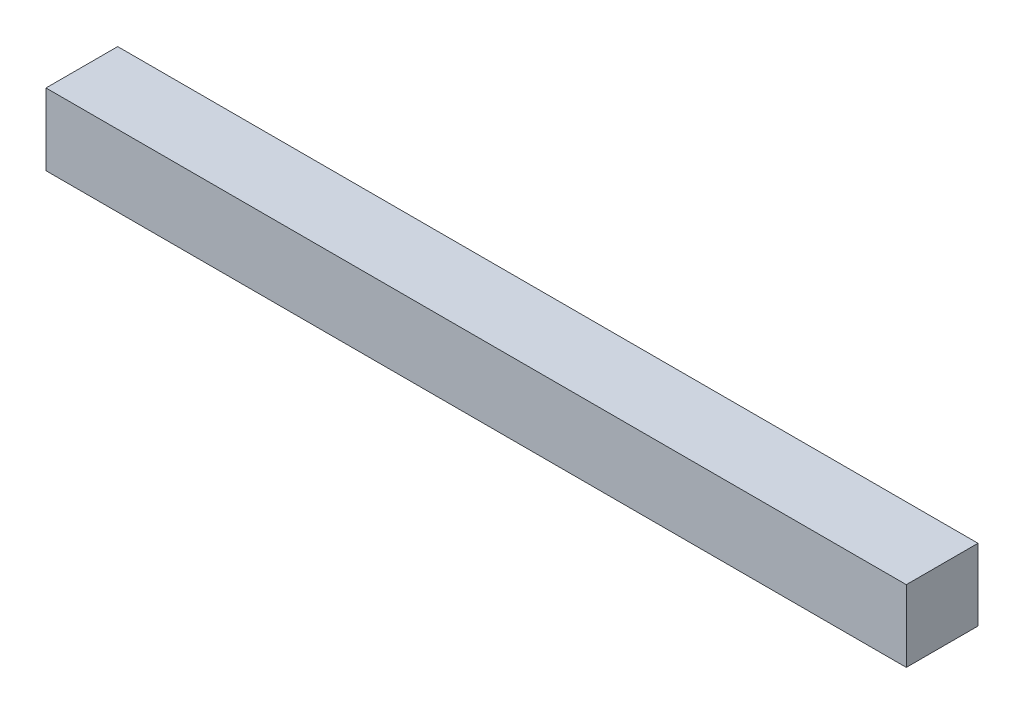
ISO-10303-21;
HEADER;
FILE_DESCRIPTION(('STEP AP214'),'2;1');
FILE_NAME('part.step','',(''),(''),'','','');
FILE_SCHEMA(('AUTOMOTIVE_DESIGN { 1 0 10303 214 1 1 1 1 }'));
ENDSEC;
DATA;
#1=APPLICATION_CONTEXT('core data for automotive mechanical design processes');
#2=APPLICATION_PROTOCOL_DEFINITION('international standard','automotive_design',2000,#1);
#3=PRODUCT_CONTEXT('',#1,'mechanical');
#4=PRODUCT('Part','Part','',(#3));
#5=PRODUCT_RELATED_PRODUCT_CATEGORY('part','',(#4));
#6=PRODUCT_DEFINITION_FORMATION('','',#4);
#7=PRODUCT_DEFINITION_CONTEXT('part definition',#1,'design');
#8=PRODUCT_DEFINITION('design','',#6,#7);
#9=PRODUCT_DEFINITION_SHAPE('','',#8);
#10=(LENGTH_UNIT() NAMED_UNIT(*) SI_UNIT(.MILLI.,.METRE.));
#11=(NAMED_UNIT(*) PLANE_ANGLE_UNIT() SI_UNIT($,.RADIAN.));
#12=(NAMED_UNIT(*) SI_UNIT($,.STERADIAN.) SOLID_ANGLE_UNIT());
#13=UNCERTAINTY_MEASURE_WITH_UNIT(LENGTH_MEASURE(1.E-05),#10,'distance_accuracy_value','');
#14=(GEOMETRIC_REPRESENTATION_CONTEXT(3) GLOBAL_UNCERTAINTY_ASSIGNED_CONTEXT((#13)) GLOBAL_UNIT_ASSIGNED_CONTEXT((#10,
#11,#12)) REPRESENTATION_CONTEXT('',''));
#15=CARTESIAN_POINT('',(0.,0.,0.));
#16=DIRECTION('',(0.,0.,1.));
#17=DIRECTION('',(1.,0.,0.));
#18=AXIS2_PLACEMENT_3D('',#15,#16,#17);
#19=CARTESIAN_POINT('',(304.8,0.,0.));
#20=DIRECTION('',(0.,0.,-1.));
#21=DIRECTION('',(0.,1.,0.));
#22=AXIS2_PLACEMENT_3D('',#19,#20,#21);
#23=PLANE('',#22);
#24=DIRECTION('',(0.,-1.,0.));
#25=VECTOR('',#24,1.);
#26=CARTESIAN_POINT('',(0.,0.,0.));
#27=LINE('',#26,#25);
#28=CARTESIAN_POINT('',(0.,0.,0.));
#29=VERTEX_POINT('',#28);
#30=CARTESIAN_POINT('',(0.,-25.4,0.));
#31=VERTEX_POINT('',#30);
#32=EDGE_CURVE('E97',#29,#31,#27,.T.);
#33=ORIENTED_EDGE('',*,*,#32,.F.);
#34=DIRECTION('',(-1.,0.,0.));
#35=VECTOR('',#34,1.);
#36=CARTESIAN_POINT('',(304.8,0.,0.));
#37=LINE('',#36,#35);
#38=CARTESIAN_POINT('',(304.8,0.,0.));
#39=VERTEX_POINT('',#38);
#40=EDGE_CURVE('E11',#39,#29,#37,.T.);
#41=ORIENTED_EDGE('',*,*,#40,.F.);
#42=DIRECTION('',(0.,-1.,0.));
#43=VECTOR('',#42,1.);
#44=CARTESIAN_POINT('',(304.8,0.,0.));
#45=LINE('',#44,#43);
#46=CARTESIAN_POINT('',(304.8,-25.4,0.));
#47=VERTEX_POINT('',#46);
#48=EDGE_CURVE('E92',#39,#47,#45,.T.);
#49=ORIENTED_EDGE('',*,*,#48,.T.);
#50=DIRECTION('',(-1.,0.,0.));
#51=VECTOR('',#50,1.);
#52=CARTESIAN_POINT('',(304.8,-25.4,0.));
#53=LINE('',#52,#51);
#54=EDGE_CURVE('E35',#47,#31,#53,.T.);
#55=ORIENTED_EDGE('',*,*,#54,.T.);
#56=EDGE_LOOP('',(#33,#41,#49,#55));
#57=FACE_BOUND('',#56,.T.);
#58=ADVANCED_FACE('F32',(#57),#23,.T.);
#59=CARTESIAN_POINT('',(304.8,0.,0.));
#60=DIRECTION('',(0.,-1.,0.));
#61=DIRECTION('',(0.,0.,-1.));
#62=AXIS2_PLACEMENT_3D('',#59,#60,#61);
#63=PLANE('',#62);
#64=DIRECTION('',(0.,0.,1.));
#65=VECTOR('',#64,1.);
#66=CARTESIAN_POINT('',(0.,0.,0.));
#67=LINE('',#66,#65);
#68=CARTESIAN_POINT('',(0.,0.,25.4));
#69=VERTEX_POINT('',#68);
#70=EDGE_CURVE('E65',#29,#69,#67,.T.);
#71=ORIENTED_EDGE('',*,*,#70,.T.);
#72=DIRECTION('',(-1.,0.,0.));
#73=VECTOR('',#72,1.);
#74=CARTESIAN_POINT('',(304.8,0.,25.4));
#75=LINE('',#74,#73);
#76=CARTESIAN_POINT('',(304.8,0.,25.4));
#77=VERTEX_POINT('',#76);
#78=EDGE_CURVE('E41',#77,#69,#75,.T.);
#79=ORIENTED_EDGE('',*,*,#78,.F.);
#80=DIRECTION('',(0.,0.,1.));
#81=VECTOR('',#80,1.);
#82=CARTESIAN_POINT('',(304.8,0.,0.));
#83=LINE('',#82,#81);
#84=EDGE_CURVE('E82',#39,#77,#83,.T.);
#85=ORIENTED_EDGE('',*,*,#84,.F.);
#86=ORIENTED_EDGE('',*,*,#40,.T.);
#87=EDGE_LOOP('',(#71,#79,#85,#86));
#88=FACE_BOUND('',#87,.T.);
#89=ADVANCED_FACE('F107',(#88),#63,.F.);
#90=CARTESIAN_POINT('',(304.8,0.,25.4));
#91=DIRECTION('',(0.,0.,-1.));
#92=DIRECTION('',(0.,1.,0.));
#93=AXIS2_PLACEMENT_3D('',#90,#91,#92);
#94=PLANE('',#93);
#95=DIRECTION('',(0.,-1.,0.));
#96=VECTOR('',#95,1.);
#97=CARTESIAN_POINT('',(0.,0.,25.4));
#98=LINE('',#97,#96);
#99=CARTESIAN_POINT('',(0.,-25.4,25.4));
#100=VERTEX_POINT('',#99);
#101=EDGE_CURVE('E89',#69,#100,#98,.T.);
#102=ORIENTED_EDGE('',*,*,#101,.T.);
#103=DIRECTION('',(-1.,0.,0.));
#104=VECTOR('',#103,1.);
#105=CARTESIAN_POINT('',(304.8,-25.4,25.4));
#106=LINE('',#105,#104);
#107=CARTESIAN_POINT('',(304.8,-25.4,25.4));
#108=VERTEX_POINT('',#107);
#109=EDGE_CURVE('E86',#108,#100,#106,.T.);
#110=ORIENTED_EDGE('',*,*,#109,.F.);
#111=DIRECTION('',(0.,-1.,0.));
#112=VECTOR('',#111,1.);
#113=CARTESIAN_POINT('',(304.8,0.,25.4));
#114=LINE('',#113,#112);
#115=EDGE_CURVE('E77',#77,#108,#114,.T.);
#116=ORIENTED_EDGE('',*,*,#115,.F.);
#117=ORIENTED_EDGE('',*,*,#78,.T.);
#118=EDGE_LOOP('',(#102,#110,#116,#117));
#119=FACE_BOUND('',#118,.T.);
#120=ADVANCED_FACE('F87',(#119),#94,.F.);
#121=CARTESIAN_POINT('',(304.8,-25.4,0.));
#122=DIRECTION('',(0.,-1.,0.));
#123=DIRECTION('',(0.,0.,-1.));
#124=AXIS2_PLACEMENT_3D('',#121,#122,#123);
#125=PLANE('',#124);
#126=DIRECTION('',(0.,0.,1.));
#127=VECTOR('',#126,1.);
#128=CARTESIAN_POINT('',(0.,-25.4,0.));
#129=LINE('',#128,#127);
#130=EDGE_CURVE('E100',#31,#100,#129,.T.);
#131=ORIENTED_EDGE('',*,*,#130,.F.);
#132=ORIENTED_EDGE('',*,*,#54,.F.);
#133=DIRECTION('',(0.,0.,1.));
#134=VECTOR('',#133,1.);
#135=CARTESIAN_POINT('',(304.8,-25.4,0.));
#136=LINE('',#135,#134);
#137=EDGE_CURVE('E81',#47,#108,#136,.T.);
#138=ORIENTED_EDGE('',*,*,#137,.T.);
#139=ORIENTED_EDGE('',*,*,#109,.T.);
#140=EDGE_LOOP('',(#131,#132,#138,#139));
#141=FACE_BOUND('',#140,.T.);
#142=ADVANCED_FACE('F91',(#141),#125,.T.);
#143=CARTESIAN_POINT('',(304.8,0.,0.));
#144=DIRECTION('',(-1.,0.,0.));
#145=DIRECTION('',(0.,0.,1.));
#146=AXIS2_PLACEMENT_3D('',#143,#144,#145);
#147=PLANE('',#146);
#148=ORIENTED_EDGE('',*,*,#48,.F.);
#149=ORIENTED_EDGE('',*,*,#84,.T.);
#150=ORIENTED_EDGE('',*,*,#115,.T.);
#151=ORIENTED_EDGE('',*,*,#137,.F.);
#152=EDGE_LOOP('',(#148,#149,#150,#151));
#153=FACE_BOUND('',#152,.T.);
#154=ADVANCED_FACE('F80',(#153),#147,.F.);
#155=CARTESIAN_POINT('',(0.,0.,0.));
#156=DIRECTION('',(-1.,0.,0.));
#157=DIRECTION('',(0.,0.,1.));
#158=AXIS2_PLACEMENT_3D('',#155,#156,#157);
#159=PLANE('',#158);
#160=ORIENTED_EDGE('',*,*,#32,.T.);
#161=ORIENTED_EDGE('',*,*,#130,.T.);
#162=ORIENTED_EDGE('',*,*,#101,.F.);
#163=ORIENTED_EDGE('',*,*,#70,.F.);
#164=EDGE_LOOP('',(#160,#161,#162,#163));
#165=FACE_BOUND('',#164,.T.);
#166=ADVANCED_FACE('F105',(#165),#159,.T.);
#167=CLOSED_SHELL('',(#58,#89,#120,#142,#154,#166));
#168=MANIFOLD_SOLID_BREP('B2',#167);
#169=ADVANCED_BREP_SHAPE_REPRESENTATION('',(#18,#168),#14);
#170=SHAPE_DEFINITION_REPRESENTATION(#9,#169);
ENDSEC;
END-ISO-10303-21;
